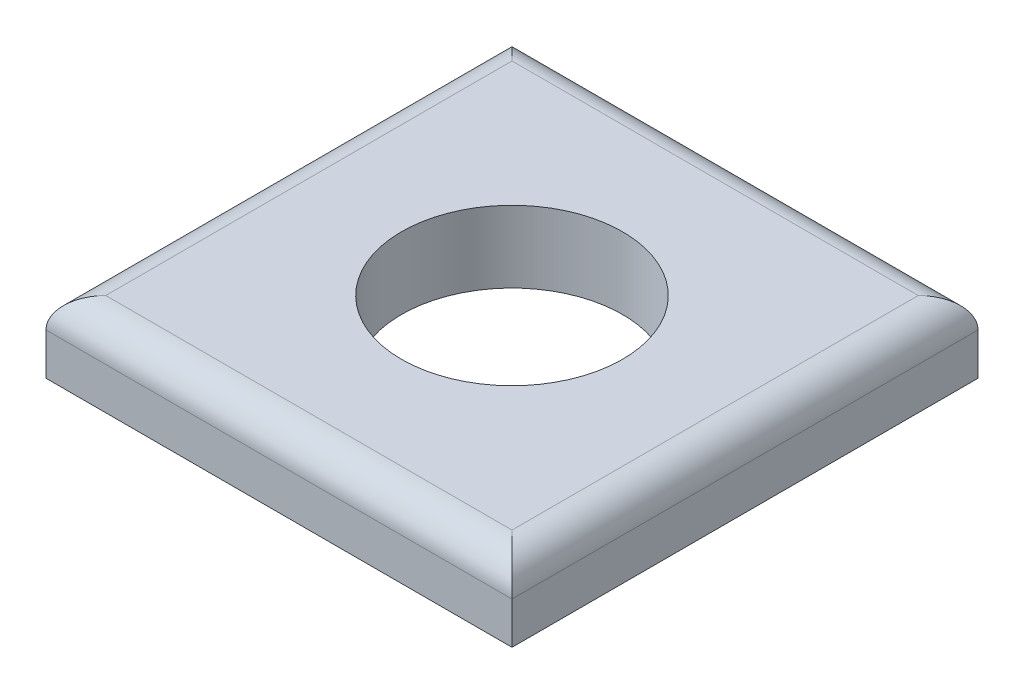
ISO-10303-21;
HEADER;
FILE_DESCRIPTION(('STEP AP214'),'2;1');
FILE_NAME('part.step','',(''),(''),'','','');
FILE_SCHEMA(('AUTOMOTIVE_DESIGN { 1 0 10303 214 1 1 1 1 }'));
ENDSEC;
DATA;
#1=APPLICATION_CONTEXT('core data for automotive mechanical design processes');
#2=APPLICATION_PROTOCOL_DEFINITION('international standard','automotive_design',2000,#1);
#3=PRODUCT_CONTEXT('',#1,'mechanical');
#4=PRODUCT('Part','Part','',(#3));
#5=PRODUCT_RELATED_PRODUCT_CATEGORY('part','',(#4));
#6=PRODUCT_DEFINITION_FORMATION('','',#4);
#7=PRODUCT_DEFINITION_CONTEXT('part definition',#1,'design');
#8=PRODUCT_DEFINITION('design','',#6,#7);
#9=PRODUCT_DEFINITION_SHAPE('','',#8);
#10=(LENGTH_UNIT() NAMED_UNIT(*) SI_UNIT(.MILLI.,.METRE.));
#11=(NAMED_UNIT(*) PLANE_ANGLE_UNIT() SI_UNIT($,.RADIAN.));
#12=(NAMED_UNIT(*) SI_UNIT($,.STERADIAN.) SOLID_ANGLE_UNIT());
#13=UNCERTAINTY_MEASURE_WITH_UNIT(LENGTH_MEASURE(1.E-05),#10,'distance_accuracy_value','');
#14=(GEOMETRIC_REPRESENTATION_CONTEXT(3) GLOBAL_UNCERTAINTY_ASSIGNED_CONTEXT((#13)) GLOBAL_UNIT_ASSIGNED_CONTEXT((#10,
#11,#12)) REPRESENTATION_CONTEXT('',''));
#15=CARTESIAN_POINT('',(0.,0.,0.));
#16=DIRECTION('',(0.,0.,1.));
#17=DIRECTION('',(1.,0.,0.));
#18=AXIS2_PLACEMENT_3D('',#15,#16,#17);
#19=CARTESIAN_POINT('',(-3.9,1.2,-3.9));
#20=DIRECTION('',(1.,0.,0.));
#21=DIRECTION('',(0.,0.,-1.));
#22=AXIS2_PLACEMENT_3D('',#19,#20,#21);
#23=PLANE('',#22);
#24=DIRECTION('',(0.,-1.,0.));
#25=VECTOR('',#24,1.);
#26=CARTESIAN_POINT('',(-3.9,1.2,3.9));
#27=LINE('',#26,#25);
#28=CARTESIAN_POINT('',(-3.9,0.7,3.9));
#29=VERTEX_POINT('',#28);
#30=CARTESIAN_POINT('',(-3.9,0.,3.9));
#31=VERTEX_POINT('',#30);
#32=EDGE_CURVE('E85',#29,#31,#27,.T.);
#33=ORIENTED_EDGE('',*,*,#32,.F.);
#34=DIRECTION('',(0.,0.,1.));
#35=VECTOR('',#34,1.);
#36=CARTESIAN_POINT('',(-3.9,0.7,-3.9));
#37=LINE('',#36,#35);
#38=CARTESIAN_POINT('',(-3.9,0.7,-3.9));
#39=VERTEX_POINT('',#38);
#40=EDGE_CURVE('E11',#29,#39,#37,.F.);
#41=ORIENTED_EDGE('',*,*,#40,.T.);
#42=DIRECTION('',(0.,-1.,0.));
#43=VECTOR('',#42,1.);
#44=CARTESIAN_POINT('',(-3.9,1.2,-3.9));
#45=LINE('',#44,#43);
#46=CARTESIAN_POINT('',(-3.9,0.,-3.9));
#47=VERTEX_POINT('',#46);
#48=EDGE_CURVE('E105',#39,#47,#45,.T.);
#49=ORIENTED_EDGE('',*,*,#48,.T.);
#50=DIRECTION('',(0.,0.,1.));
#51=VECTOR('',#50,1.);
#52=CARTESIAN_POINT('',(-3.9,0.,-3.9));
#53=LINE('',#52,#51);
#54=EDGE_CURVE('E101',#47,#31,#53,.T.);
#55=ORIENTED_EDGE('',*,*,#54,.T.);
#56=EDGE_LOOP('',(#33,#41,#49,#55));
#57=FACE_BOUND('',#56,.T.);
#58=ADVANCED_FACE('F35',(#57),#23,.F.);
#59=CARTESIAN_POINT('',(-3.9,1.2,3.9));
#60=DIRECTION('',(0.,0.,-1.));
#61=DIRECTION('',(-1.,0.,0.));
#62=AXIS2_PLACEMENT_3D('',#59,#60,#61);
#63=PLANE('',#62);
#64=DIRECTION('',(0.,-1.,0.));
#65=VECTOR('',#64,1.);
#66=CARTESIAN_POINT('',(3.9,1.2,3.9));
#67=LINE('',#66,#65);
#68=CARTESIAN_POINT('',(3.9,0.7,3.9));
#69=VERTEX_POINT('',#68);
#70=CARTESIAN_POINT('',(3.9,0.,3.9));
#71=VERTEX_POINT('',#70);
#72=EDGE_CURVE('E95',#69,#71,#67,.T.);
#73=ORIENTED_EDGE('',*,*,#72,.F.);
#74=DIRECTION('',(1.,0.,0.));
#75=VECTOR('',#74,1.);
#76=CARTESIAN_POINT('',(-3.9,0.7,3.9));
#77=LINE('',#76,#75);
#78=EDGE_CURVE('E92',#69,#29,#77,.F.);
#79=ORIENTED_EDGE('',*,*,#78,.T.);
#80=ORIENTED_EDGE('',*,*,#32,.T.);
#81=DIRECTION('',(1.,0.,0.));
#82=VECTOR('',#81,1.);
#83=CARTESIAN_POINT('',(-3.9,0.,3.9));
#84=LINE('',#83,#82);
#85=EDGE_CURVE('E89',#31,#71,#84,.T.);
#86=ORIENTED_EDGE('',*,*,#85,.T.);
#87=EDGE_LOOP('',(#73,#79,#80,#86));
#88=FACE_BOUND('',#87,.T.);
#89=ADVANCED_FACE('F88',(#88),#63,.F.);
#90=CARTESIAN_POINT('',(3.9,1.2,-3.9));
#91=DIRECTION('',(-1.,0.,0.));
#92=DIRECTION('',(0.,0.,1.));
#93=AXIS2_PLACEMENT_3D('',#90,#91,#92);
#94=PLANE('',#93);
#95=DIRECTION('',(0.,-1.,0.));
#96=VECTOR('',#95,1.);
#97=CARTESIAN_POINT('',(3.9,1.2,-3.9));
#98=LINE('',#97,#96);
#99=CARTESIAN_POINT('',(3.9,0.7,-3.9));
#100=VERTEX_POINT('',#99);
#101=CARTESIAN_POINT('',(3.9,0.,-3.9));
#102=VERTEX_POINT('',#101);
#103=EDGE_CURVE('E118',#100,#102,#98,.T.);
#104=ORIENTED_EDGE('',*,*,#103,.F.);
#105=DIRECTION('',(0.,0.,-1.));
#106=VECTOR('',#105,1.);
#107=CARTESIAN_POINT('',(3.9,0.7,3.9));
#108=LINE('',#107,#106);
#109=EDGE_CURVE('E130',#100,#69,#108,.F.);
#110=ORIENTED_EDGE('',*,*,#109,.T.);
#111=ORIENTED_EDGE('',*,*,#72,.T.);
#112=DIRECTION('',(0.,0.,-1.));
#113=VECTOR('',#112,1.);
#114=CARTESIAN_POINT('',(3.9,0.,-3.9));
#115=LINE('',#114,#113);
#116=EDGE_CURVE('E103',#71,#102,#115,.T.);
#117=ORIENTED_EDGE('',*,*,#116,.T.);
#118=EDGE_LOOP('',(#104,#110,#111,#117));
#119=FACE_BOUND('',#118,.T.);
#120=ADVANCED_FACE('F133',(#119),#94,.F.);
#121=CARTESIAN_POINT('',(-3.9,1.2,-3.9));
#122=DIRECTION('',(0.,0.,1.));
#123=DIRECTION('',(1.,0.,0.));
#124=AXIS2_PLACEMENT_3D('',#121,#122,#123);
#125=PLANE('',#124);
#126=ORIENTED_EDGE('',*,*,#48,.F.);
#127=DIRECTION('',(-1.,0.,0.));
#128=VECTOR('',#127,1.);
#129=CARTESIAN_POINT('',(3.9,0.7,-3.9));
#130=LINE('',#129,#128);
#131=EDGE_CURVE('E42',#39,#100,#130,.F.);
#132=ORIENTED_EDGE('',*,*,#131,.T.);
#133=ORIENTED_EDGE('',*,*,#103,.T.);
#134=DIRECTION('',(-1.,0.,0.));
#135=VECTOR('',#134,1.);
#136=CARTESIAN_POINT('',(-3.9,0.,-3.9));
#137=LINE('',#136,#135);
#138=EDGE_CURVE('E115',#102,#47,#137,.T.);
#139=ORIENTED_EDGE('',*,*,#138,.T.);
#140=EDGE_LOOP('',(#126,#132,#133,#139));
#141=FACE_BOUND('',#140,.T.);
#142=ADVANCED_FACE('F160',(#141),#125,.F.);
#143=CARTESIAN_POINT('',(-3.9,1.2,3.9));
#144=DIRECTION('',(0.,1.,0.));
#145=DIRECTION('',(0.,0.,1.));
#146=AXIS2_PLACEMENT_3D('',#143,#144,#145);
#147=PLANE('',#146);
#148=DIRECTION('',(0.,0.,1.));
#149=VECTOR('',#148,1.);
#150=CARTESIAN_POINT('',(-3.4,1.2,3.9));
#151=LINE('',#150,#149);
#152=CARTESIAN_POINT('',(-3.4,1.2,-3.4));
#153=VERTEX_POINT('',#152);
#154=CARTESIAN_POINT('',(-3.4,1.2,3.4));
#155=VERTEX_POINT('',#154);
#156=EDGE_CURVE('E94',#153,#155,#151,.T.);
#157=ORIENTED_EDGE('',*,*,#156,.T.);
#158=DIRECTION('',(1.,0.,0.));
#159=VECTOR('',#158,1.);
#160=CARTESIAN_POINT('',(3.9,1.2,3.4));
#161=LINE('',#160,#159);
#162=CARTESIAN_POINT('',(3.4,1.2,3.4));
#163=VERTEX_POINT('',#162);
#164=EDGE_CURVE('E126',#155,#163,#161,.T.);
#165=ORIENTED_EDGE('',*,*,#164,.T.);
#166=DIRECTION('',(0.,0.,-1.));
#167=VECTOR('',#166,1.);
#168=CARTESIAN_POINT('',(3.4,1.2,-3.9));
#169=LINE('',#168,#167);
#170=CARTESIAN_POINT('',(3.4,1.2,-3.4));
#171=VERTEX_POINT('',#170);
#172=EDGE_CURVE('E124',#163,#171,#169,.T.);
#173=ORIENTED_EDGE('',*,*,#172,.T.);
#174=DIRECTION('',(-1.,0.,0.));
#175=VECTOR('',#174,1.);
#176=CARTESIAN_POINT('',(-3.9,1.2,-3.4));
#177=LINE('',#176,#175);
#178=EDGE_CURVE('E122',#171,#153,#177,.T.);
#179=ORIENTED_EDGE('',*,*,#178,.T.);
#180=EDGE_LOOP('',(#157,#165,#173,#179));
#181=FACE_BOUND('',#180,.T.);
#182=CARTESIAN_POINT('',(0.,1.2,0.));
#183=DIRECTION('',(0.,1.,0.));
#184=DIRECTION('',(0.,0.,1.));
#185=AXIS2_PLACEMENT_3D('',#182,#183,#184);
#186=CIRCLE('',#185,1.85);
#187=CARTESIAN_POINT('',(0.,1.2,1.85));
#188=VERTEX_POINT('',#187);
#189=EDGE_CURVE('E110',#188,#188,#186,.T.);
#190=ORIENTED_EDGE('',*,*,#189,.F.);
#191=EDGE_LOOP('',(#190));
#192=FACE_BOUND('',#191,.T.);
#193=ADVANCED_FACE('F158',(#181,#192),#147,.T.);
#194=CARTESIAN_POINT('',(-3.9,0.,3.9));
#195=DIRECTION('',(0.,1.,0.));
#196=DIRECTION('',(0.,0.,1.));
#197=AXIS2_PLACEMENT_3D('',#194,#195,#196);
#198=PLANE('',#197);
#199=CARTESIAN_POINT('',(0.,0.,0.));
#200=DIRECTION('',(0.,1.,0.));
#201=DIRECTION('',(0.,0.,1.));
#202=AXIS2_PLACEMENT_3D('',#199,#200,#201);
#203=CIRCLE('',#202,1.85);
#204=CARTESIAN_POINT('',(0.,0.,1.85));
#205=VERTEX_POINT('',#204);
#206=EDGE_CURVE('E107',#205,#205,#203,.T.);
#207=ORIENTED_EDGE('',*,*,#206,.T.);
#208=EDGE_LOOP('',(#207));
#209=FACE_BOUND('',#208,.T.);
#210=ORIENTED_EDGE('',*,*,#54,.F.);
#211=ORIENTED_EDGE('',*,*,#138,.F.);
#212=ORIENTED_EDGE('',*,*,#116,.F.);
#213=ORIENTED_EDGE('',*,*,#85,.F.);
#214=EDGE_LOOP('',(#210,#211,#212,#213));
#215=FACE_BOUND('',#214,.T.);
#216=ADVANCED_FACE('F99',(#209,#215),#198,.F.);
#217=CARTESIAN_POINT('',(0.,0.,0.));
#218=DIRECTION('',(0.,1.,0.));
#219=DIRECTION('',(0.,0.,1.));
#220=AXIS2_PLACEMENT_3D('',#217,#218,#219);
#221=CYLINDRICAL_SURFACE('',#220,1.85);
#222=ORIENTED_EDGE('',*,*,#206,.F.);
#223=EDGE_LOOP('',(#222));
#224=FACE_BOUND('',#223,.T.);
#225=ORIENTED_EDGE('',*,*,#189,.T.);
#226=EDGE_LOOP('',(#225));
#227=FACE_BOUND('',#226,.T.);
#228=ADVANCED_FACE('F156',(#224,#227),#221,.F.);
#229=CARTESIAN_POINT('',(-3.9,0.7,-3.4));
#230=DIRECTION('',(1.,0.,0.));
#231=DIRECTION('',(0.,0.,-1.));
#232=AXIS2_PLACEMENT_3D('',#229,#230,#231);
#233=CYLINDRICAL_SURFACE('',#232,0.5);
#234=CARTESIAN_POINT('',(3.4,0.7,-3.4));
#235=DIRECTION('',(0.707106781186547,0.,0.707106781186547));
#236=DIRECTION('',(0.707106781186547,0.,-0.707106781186547));
#237=AXIS2_PLACEMENT_3D('',#234,#235,#236);
#238=ELLIPSE('',#237,0.707106781186548,0.5);
#239=EDGE_CURVE('E147',#100,#171,#238,.T.);
#240=ORIENTED_EDGE('',*,*,#239,.F.);
#241=ORIENTED_EDGE('',*,*,#131,.F.);
#242=CARTESIAN_POINT('',(-3.4,0.7,-3.4));
#243=DIRECTION('',(0.707106781186547,0.,-0.707106781186548));
#244=DIRECTION('',(-0.707106781186548,0.,-0.707106781186547));
#245=AXIS2_PLACEMENT_3D('',#242,#243,#244);
#246=ELLIPSE('',#245,0.707106781186548,0.5);
#247=EDGE_CURVE('E151',#153,#39,#246,.F.);
#248=ORIENTED_EDGE('',*,*,#247,.F.);
#249=ORIENTED_EDGE('',*,*,#178,.F.);
#250=EDGE_LOOP('',(#240,#241,#248,#249));
#251=FACE_BOUND('',#250,.T.);
#252=ADVANCED_FACE('F194',(#251),#233,.T.);
#253=CARTESIAN_POINT('',(-3.4,0.7,3.9));
#254=DIRECTION('',(0.,0.,-1.));
#255=DIRECTION('',(-1.,0.,0.));
#256=AXIS2_PLACEMENT_3D('',#253,#254,#255);
#257=CYLINDRICAL_SURFACE('',#256,0.5);
#258=ORIENTED_EDGE('',*,*,#247,.T.);
#259=ORIENTED_EDGE('',*,*,#40,.F.);
#260=CARTESIAN_POINT('',(-3.4,0.7,3.4));
#261=DIRECTION('',(-0.707106781186548,0.,-0.707106781186547));
#262=DIRECTION('',(0.707106781186547,0.,-0.707106781186548));
#263=AXIS2_PLACEMENT_3D('',#260,#261,#262);
#264=ELLIPSE('',#263,0.707106781186547,0.5);
#265=EDGE_CURVE('E144',#155,#29,#264,.F.);
#266=ORIENTED_EDGE('',*,*,#265,.F.);
#267=ORIENTED_EDGE('',*,*,#156,.F.);
#268=EDGE_LOOP('',(#258,#259,#266,#267));
#269=FACE_BOUND('',#268,.T.);
#270=ADVANCED_FACE('F199',(#269),#257,.T.);
#271=CARTESIAN_POINT('',(3.4,0.7,3.9));
#272=DIRECTION('',(0.,0.,1.));
#273=DIRECTION('',(1.,0.,0.));
#274=AXIS2_PLACEMENT_3D('',#271,#272,#273);
#275=CYLINDRICAL_SURFACE('',#274,0.5);
#276=ORIENTED_EDGE('',*,*,#239,.T.);
#277=ORIENTED_EDGE('',*,*,#172,.F.);
#278=CARTESIAN_POINT('',(3.4,0.7,3.4));
#279=DIRECTION('',(-0.707106781186547,0.,0.707106781186547));
#280=DIRECTION('',(0.707106781186547,0.,0.707106781186547));
#281=AXIS2_PLACEMENT_3D('',#278,#279,#280);
#282=ELLIPSE('',#281,0.707106781186547,0.5);
#283=EDGE_CURVE('E141',#69,#163,#282,.T.);
#284=ORIENTED_EDGE('',*,*,#283,.F.);
#285=ORIENTED_EDGE('',*,*,#109,.F.);
#286=EDGE_LOOP('',(#276,#277,#284,#285));
#287=FACE_BOUND('',#286,.T.);
#288=ADVANCED_FACE('F145',(#287),#275,.T.);
#289=CARTESIAN_POINT('',(-3.9,0.7,3.4));
#290=DIRECTION('',(-1.,0.,0.));
#291=DIRECTION('',(0.,0.,1.));
#292=AXIS2_PLACEMENT_3D('',#289,#290,#291);
#293=CYLINDRICAL_SURFACE('',#292,0.5);
#294=ORIENTED_EDGE('',*,*,#265,.T.);
#295=ORIENTED_EDGE('',*,*,#78,.F.);
#296=ORIENTED_EDGE('',*,*,#283,.T.);
#297=ORIENTED_EDGE('',*,*,#164,.F.);
#298=EDGE_LOOP('',(#294,#295,#296,#297));
#299=FACE_BOUND('',#298,.T.);
#300=ADVANCED_FACE('F139',(#299),#293,.T.);
#301=CLOSED_SHELL('',(#58,#89,#120,#142,#193,#216,#228,#252,#270,#288,#300));
#302=MANIFOLD_SOLID_BREP('B2',#301);
#303=ADVANCED_BREP_SHAPE_REPRESENTATION('',(#18,#302),#14);
#304=SHAPE_DEFINITION_REPRESENTATION(#9,#303);
ENDSEC;
END-ISO-10303-21;
